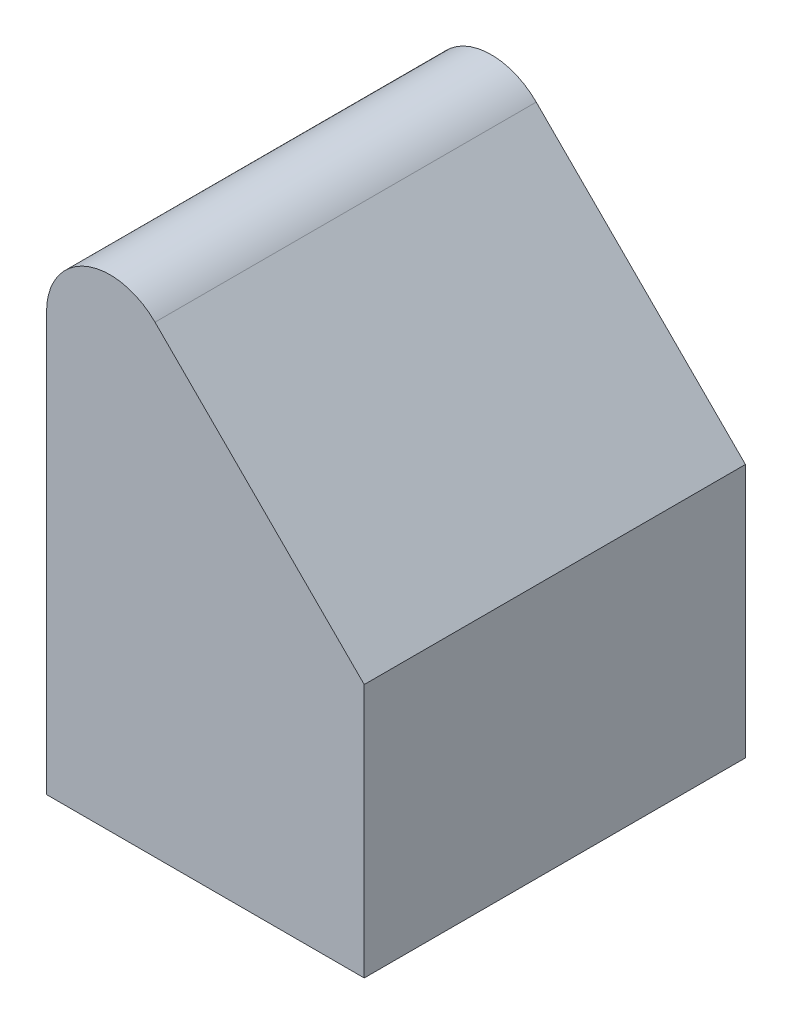
ISO-10303-21;
HEADER;
FILE_DESCRIPTION(('STEP AP214'),'2;1');
FILE_NAME('part.step','',(''),(''),'','','');
FILE_SCHEMA(('AUTOMOTIVE_DESIGN { 1 0 10303 214 1 1 1 1 }'));
ENDSEC;
DATA;
#1=APPLICATION_CONTEXT('core data for automotive mechanical design processes');
#2=APPLICATION_PROTOCOL_DEFINITION('international standard','automotive_design',2000,#1);
#3=PRODUCT_CONTEXT('',#1,'mechanical');
#4=PRODUCT('Part','Part','',(#3));
#5=PRODUCT_RELATED_PRODUCT_CATEGORY('part','',(#4));
#6=PRODUCT_DEFINITION_FORMATION('','',#4);
#7=PRODUCT_DEFINITION_CONTEXT('part definition',#1,'design');
#8=PRODUCT_DEFINITION('design','',#6,#7);
#9=PRODUCT_DEFINITION_SHAPE('','',#8);
#10=(LENGTH_UNIT() NAMED_UNIT(*) SI_UNIT(.MILLI.,.METRE.));
#11=(NAMED_UNIT(*) PLANE_ANGLE_UNIT() SI_UNIT($,.RADIAN.));
#12=(NAMED_UNIT(*) SI_UNIT($,.STERADIAN.) SOLID_ANGLE_UNIT());
#13=UNCERTAINTY_MEASURE_WITH_UNIT(LENGTH_MEASURE(1.E-05),#10,'distance_accuracy_value','');
#14=(GEOMETRIC_REPRESENTATION_CONTEXT(3) GLOBAL_UNCERTAINTY_ASSIGNED_CONTEXT((#13)) GLOBAL_UNIT_ASSIGNED_CONTEXT((#10,
#11,#12)) REPRESENTATION_CONTEXT('',''));
#15=CARTESIAN_POINT('',(0.,0.,0.));
#16=DIRECTION('',(0.,0.,1.));
#17=DIRECTION('',(1.,0.,0.));
#18=AXIS2_PLACEMENT_3D('',#15,#16,#17);
#19=CARTESIAN_POINT('',(25.,-20.,0.));
#20=DIRECTION('',(0.,0.,1.));
#21=DIRECTION('',(1.,0.,0.));
#22=AXIS2_PLACEMENT_3D('',#19,#20,#21);
#23=PLANE('',#22);
#24=DIRECTION('',(0.,1.,0.));
#25=VECTOR('',#24,1.);
#26=CARTESIAN_POINT('',(0.,-20.,0.));
#27=LINE('',#26,#25);
#28=CARTESIAN_POINT('',(0.,-20.,0.));
#29=VERTEX_POINT('',#28);
#30=CARTESIAN_POINT('',(0.,12.9289321881344,0.));
#31=VERTEX_POINT('',#30);
#32=EDGE_CURVE('E100',#29,#31,#27,.T.);
#33=ORIENTED_EDGE('',*,*,#32,.T.);
#34=CARTESIAN_POINT('',(5.,12.9289321881344,0.));
#35=DIRECTION('',(0.,0.,1.));
#36=DIRECTION('',(1.,0.,0.));
#37=AXIS2_PLACEMENT_3D('',#34,#35,#36);
#38=CIRCLE('',#37,5.);
#39=CARTESIAN_POINT('',(8.53553390593272,16.4644660940671,0.));
#40=VERTEX_POINT('',#39);
#41=EDGE_CURVE('E55',#31,#40,#38,.F.);
#42=ORIENTED_EDGE('',*,*,#41,.T.);
#43=DIRECTION('',(0.707106781186551,-0.707106781186544,0.));
#44=VECTOR('',#43,1.);
#45=CARTESIAN_POINT('',(0.,24.9999999999997,0.));
#46=LINE('',#45,#44);
#47=CARTESIAN_POINT('',(25.,0.,0.));
#48=VERTEX_POINT('',#47);
#49=EDGE_CURVE('E76',#40,#48,#46,.T.);
#50=ORIENTED_EDGE('',*,*,#49,.T.);
#51=DIRECTION('',(0.,1.,0.));
#52=VECTOR('',#51,1.);
#53=CARTESIAN_POINT('',(25.,-20.,0.));
#54=LINE('',#53,#52);
#55=CARTESIAN_POINT('',(25.,-20.,0.));
#56=VERTEX_POINT('',#55);
#57=EDGE_CURVE('E79',#56,#48,#54,.T.);
#58=ORIENTED_EDGE('',*,*,#57,.F.);
#59=DIRECTION('',(-1.,0.,0.));
#60=VECTOR('',#59,1.);
#61=CARTESIAN_POINT('',(25.,-20.,0.));
#62=LINE('',#61,#60);
#63=EDGE_CURVE('E99',#56,#29,#62,.T.);
#64=ORIENTED_EDGE('',*,*,#63,.T.);
#65=EDGE_LOOP('',(#33,#42,#50,#58,#64));
#66=FACE_BOUND('',#65,.T.);
#67=ADVANCED_FACE('F33',(#66),#23,.F.);
#68=CARTESIAN_POINT('',(25.,-20.,30.));
#69=DIRECTION('',(0.,0.,-1.));
#70=DIRECTION('',(-1.,0.,0.));
#71=AXIS2_PLACEMENT_3D('',#68,#69,#70);
#72=PLANE('',#71);
#73=DIRECTION('',(0.707106781186551,-0.707106781186544,0.));
#74=VECTOR('',#73,1.);
#75=CARTESIAN_POINT('',(0.,24.9999999999997,30.));
#76=LINE('',#75,#74);
#77=CARTESIAN_POINT('',(8.53553390593272,16.4644660940671,30.));
#78=VERTEX_POINT('',#77);
#79=CARTESIAN_POINT('',(25.,0.,30.));
#80=VERTEX_POINT('',#79);
#81=EDGE_CURVE('E81',#78,#80,#76,.T.);
#82=ORIENTED_EDGE('',*,*,#81,.F.);
#83=CARTESIAN_POINT('',(5.,12.9289321881344,30.));
#84=DIRECTION('',(0.,0.,-1.));
#85=DIRECTION('',(-1.,0.,0.));
#86=AXIS2_PLACEMENT_3D('',#83,#84,#85);
#87=CIRCLE('',#86,5.);
#88=CARTESIAN_POINT('',(0.,12.9289321881344,30.));
#89=VERTEX_POINT('',#88);
#90=EDGE_CURVE('E11',#78,#89,#87,.F.);
#91=ORIENTED_EDGE('',*,*,#90,.T.);
#92=DIRECTION('',(0.,-1.,0.));
#93=VECTOR('',#92,1.);
#94=CARTESIAN_POINT('',(0.,-20.,30.));
#95=LINE('',#94,#93);
#96=CARTESIAN_POINT('',(0.,-20.,30.));
#97=VERTEX_POINT('',#96);
#98=EDGE_CURVE('E102',#89,#97,#95,.T.);
#99=ORIENTED_EDGE('',*,*,#98,.T.);
#100=DIRECTION('',(-1.,0.,0.));
#101=VECTOR('',#100,1.);
#102=CARTESIAN_POINT('',(25.,-20.,30.));
#103=LINE('',#102,#101);
#104=CARTESIAN_POINT('',(25.,-20.,30.));
#105=VERTEX_POINT('',#104);
#106=EDGE_CURVE('E106',#105,#97,#103,.T.);
#107=ORIENTED_EDGE('',*,*,#106,.F.);
#108=DIRECTION('',(0.,-1.,0.));
#109=VECTOR('',#108,1.);
#110=CARTESIAN_POINT('',(25.,-20.,30.));
#111=LINE('',#110,#109);
#112=EDGE_CURVE('E94',#80,#105,#111,.T.);
#113=ORIENTED_EDGE('',*,*,#112,.F.);
#114=EDGE_LOOP('',(#82,#91,#99,#107,#113));
#115=FACE_BOUND('',#114,.T.);
#116=ADVANCED_FACE('F124',(#115),#72,.F.);
#117=CARTESIAN_POINT('',(25.,-20.,0.));
#118=DIRECTION('',(0.,1.,0.));
#119=DIRECTION('',(0.,0.,1.));
#120=AXIS2_PLACEMENT_3D('',#117,#118,#119);
#121=PLANE('',#120);
#122=DIRECTION('',(0.,0.,-1.));
#123=VECTOR('',#122,1.);
#124=CARTESIAN_POINT('',(0.,-20.,0.));
#125=LINE('',#124,#123);
#126=EDGE_CURVE('E91',#97,#29,#125,.T.);
#127=ORIENTED_EDGE('',*,*,#126,.T.);
#128=ORIENTED_EDGE('',*,*,#63,.F.);
#129=DIRECTION('',(0.,0.,-1.));
#130=VECTOR('',#129,1.);
#131=CARTESIAN_POINT('',(25.,-20.,0.));
#132=LINE('',#131,#130);
#133=EDGE_CURVE('E89',#105,#56,#132,.T.);
#134=ORIENTED_EDGE('',*,*,#133,.F.);
#135=ORIENTED_EDGE('',*,*,#106,.T.);
#136=EDGE_LOOP('',(#127,#128,#134,#135));
#137=FACE_BOUND('',#136,.T.);
#138=ADVANCED_FACE('F121',(#137),#121,.F.);
#139=CARTESIAN_POINT('',(25.,0.,0.));
#140=DIRECTION('',(1.,0.,0.));
#141=DIRECTION('',(0.,0.,-1.));
#142=AXIS2_PLACEMENT_3D('',#139,#140,#141);
#143=PLANE('',#142);
#144=ORIENTED_EDGE('',*,*,#57,.T.);
#145=DIRECTION('',(0.,0.,1.));
#146=VECTOR('',#145,1.);
#147=CARTESIAN_POINT('',(25.,0.,0.));
#148=LINE('',#147,#146);
#149=EDGE_CURVE('E86',#48,#80,#148,.T.);
#150=ORIENTED_EDGE('',*,*,#149,.T.);
#151=ORIENTED_EDGE('',*,*,#112,.T.);
#152=ORIENTED_EDGE('',*,*,#133,.T.);
#153=EDGE_LOOP('',(#144,#150,#151,#152));
#154=FACE_BOUND('',#153,.T.);
#155=ADVANCED_FACE('F85',(#154),#143,.T.);
#156=CARTESIAN_POINT('',(0.,0.,0.));
#157=DIRECTION('',(1.,0.,0.));
#158=DIRECTION('',(0.,0.,-1.));
#159=AXIS2_PLACEMENT_3D('',#156,#157,#158);
#160=PLANE('',#159);
#161=ORIENTED_EDGE('',*,*,#98,.F.);
#162=DIRECTION('',(0.,0.,-1.));
#163=VECTOR('',#162,1.);
#164=CARTESIAN_POINT('',(0.,12.9289321881344,0.));
#165=LINE('',#164,#163);
#166=EDGE_CURVE('E109',#89,#31,#165,.T.);
#167=ORIENTED_EDGE('',*,*,#166,.T.);
#168=ORIENTED_EDGE('',*,*,#32,.F.);
#169=ORIENTED_EDGE('',*,*,#126,.F.);
#170=EDGE_LOOP('',(#161,#167,#168,#169));
#171=FACE_BOUND('',#170,.T.);
#172=ADVANCED_FACE('F116',(#171),#160,.F.);
#173=CARTESIAN_POINT('',(0.,24.9999999999997,30.));
#174=DIRECTION('',(0.707106781186544,0.707106781186551,0.));
#175=DIRECTION('',(-0.707106781186551,0.707106781186544,0.));
#176=AXIS2_PLACEMENT_3D('',#173,#174,#175);
#177=PLANE('',#176);
#178=ORIENTED_EDGE('',*,*,#49,.F.);
#179=DIRECTION('',(0.,0.,-1.));
#180=VECTOR('',#179,1.);
#181=CARTESIAN_POINT('',(8.53553390593272,16.4644660940671,30.));
#182=LINE('',#181,#180);
#183=EDGE_CURVE('E41',#40,#78,#182,.F.);
#184=ORIENTED_EDGE('',*,*,#183,.T.);
#185=ORIENTED_EDGE('',*,*,#81,.T.);
#186=ORIENTED_EDGE('',*,*,#149,.F.);
#187=EDGE_LOOP('',(#178,#184,#185,#186));
#188=FACE_BOUND('',#187,.T.);
#189=ADVANCED_FACE('F93',(#188),#177,.T.);
#190=CARTESIAN_POINT('',(5.,12.9289321881344,0.));
#191=DIRECTION('',(0.,0.,1.));
#192=DIRECTION('',(1.,0.,0.));
#193=AXIS2_PLACEMENT_3D('',#190,#191,#192);
#194=CYLINDRICAL_SURFACE('',#193,5.);
#195=ORIENTED_EDGE('',*,*,#90,.F.);
#196=ORIENTED_EDGE('',*,*,#183,.F.);
#197=ORIENTED_EDGE('',*,*,#41,.F.);
#198=ORIENTED_EDGE('',*,*,#166,.F.);
#199=EDGE_LOOP('',(#195,#196,#197,#198));
#200=FACE_BOUND('',#199,.T.);
#201=ADVANCED_FACE('F35',(#200),#194,.T.);
#202=CLOSED_SHELL('',(#67,#116,#138,#155,#172,#189,#201));
#203=MANIFOLD_SOLID_BREP('B2',#202);
#204=ADVANCED_BREP_SHAPE_REPRESENTATION('',(#18,#203),#14);
#205=SHAPE_DEFINITION_REPRESENTATION(#9,#204);
ENDSEC;
END-ISO-10303-21;
